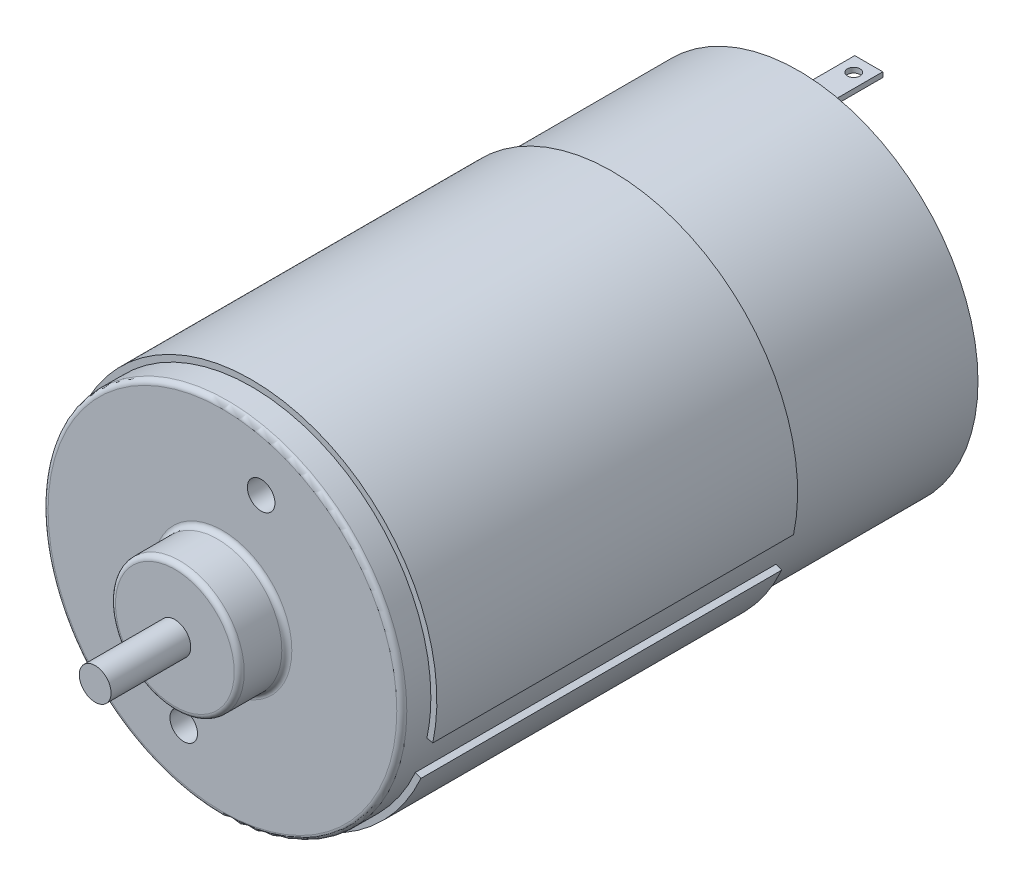
ISO-10303-21;
HEADER;
FILE_DESCRIPTION(('STEP AP214'),'2;1');
FILE_NAME('part.step','',(''),(''),'','','');
FILE_SCHEMA(('AUTOMOTIVE_DESIGN { 1 0 10303 214 1 1 1 1 }'));
ENDSEC;
DATA;
#1=APPLICATION_CONTEXT('core data for automotive mechanical design processes');
#2=APPLICATION_PROTOCOL_DEFINITION('international standard','automotive_design',2000,#1);
#3=PRODUCT_CONTEXT('',#1,'mechanical');
#4=PRODUCT('Part','Part','',(#3));
#5=PRODUCT_RELATED_PRODUCT_CATEGORY('part','',(#4));
#6=PRODUCT_DEFINITION_FORMATION('','',#4);
#7=PRODUCT_DEFINITION_CONTEXT('part definition',#1,'design');
#8=PRODUCT_DEFINITION('design','',#6,#7);
#9=PRODUCT_DEFINITION_SHAPE('','',#8);
#10=(LENGTH_UNIT() NAMED_UNIT(*) SI_UNIT(.MILLI.,.METRE.));
#11=(NAMED_UNIT(*) PLANE_ANGLE_UNIT() SI_UNIT($,.RADIAN.));
#12=(NAMED_UNIT(*) SI_UNIT($,.STERADIAN.) SOLID_ANGLE_UNIT());
#13=UNCERTAINTY_MEASURE_WITH_UNIT(LENGTH_MEASURE(1.E-05),#10,'distance_accuracy_value','');
#14=(GEOMETRIC_REPRESENTATION_CONTEXT(3) GLOBAL_UNCERTAINTY_ASSIGNED_CONTEXT((#13)) GLOBAL_UNIT_ASSIGNED_CONTEXT((#10,
#11,#12)) REPRESENTATION_CONTEXT('',''));
#15=CARTESIAN_POINT('',(0.,0.,0.));
#16=DIRECTION('',(0.,0.,1.));
#17=DIRECTION('',(1.,0.,0.));
#18=AXIS2_PLACEMENT_3D('',#15,#16,#17);
#19=CARTESIAN_POINT('',(0.,0.,57.5));
#20=DIRECTION('',(0.,0.,-1.));
#21=DIRECTION('',(-1.,0.,0.));
#22=AXIS2_PLACEMENT_3D('',#19,#20,#21);
#23=CYLINDRICAL_SURFACE('',#22,17.9);
#24=CARTESIAN_POINT('',(0.,0.,57.));
#25=DIRECTION('',(0.,0.,1.));
#26=DIRECTION('',(1.,0.,0.));
#27=AXIS2_PLACEMENT_3D('',#24,#25,#26);
#28=CIRCLE('',#27,17.9);
#29=CARTESIAN_POINT('',(17.9,0.,57.));
#30=VERTEX_POINT('',#29);
#31=EDGE_CURVE('E12',#30,#30,#28,.F.);
#32=ORIENTED_EDGE('',*,*,#31,.T.);
#33=EDGE_LOOP('',(#32));
#34=FACE_BOUND('',#33,.T.);
#35=CARTESIAN_POINT('',(0.,0.,0.));
#36=DIRECTION('',(0.,0.,1.));
#37=DIRECTION('',(1.,0.,0.));
#38=AXIS2_PLACEMENT_3D('',#35,#36,#37);
#39=CIRCLE('',#38,17.9);
#40=CARTESIAN_POINT('',(17.9,0.,0.));
#41=VERTEX_POINT('',#40);
#42=EDGE_CURVE('E337',#41,#41,#39,.T.);
#43=ORIENTED_EDGE('',*,*,#42,.T.);
#44=EDGE_LOOP('',(#43));
#45=FACE_BOUND('',#44,.T.);
#46=CARTESIAN_POINT('',(0.,0.,18.6));
#47=DIRECTION('',(0.,0.,1.));
#48=DIRECTION('',(1.,0.,0.));
#49=AXIS2_PLACEMENT_3D('',#46,#47,#48);
#50=CIRCLE('',#49,17.9);
#51=CARTESIAN_POINT('',(17.5070648099402,-3.72997074258686,18.6));
#52=VERTEX_POINT('',#51);
#53=CARTESIAN_POINT('',(16.3559347468402,-7.27278478693722,18.6));
#54=VERTEX_POINT('',#53);
#55=EDGE_CURVE('E161',#52,#54,#50,.T.);
#56=ORIENTED_EDGE('',*,*,#55,.F.);
#57=DIRECTION('',(0.,0.,1.));
#58=VECTOR('',#57,1.);
#59=CARTESIAN_POINT('',(17.5070648099402,-3.72997074258686,18.6));
#60=LINE('',#59,#58);
#61=CARTESIAN_POINT('',(17.5070648099402,-3.72997074258686,54.6));
#62=VERTEX_POINT('',#61);
#63=EDGE_CURVE('E167',#52,#62,#60,.T.);
#64=ORIENTED_EDGE('',*,*,#63,.T.);
#65=CARTESIAN_POINT('',(0.,0.,54.6));
#66=DIRECTION('',(0.,0.,1.));
#67=DIRECTION('',(1.,0.,0.));
#68=AXIS2_PLACEMENT_3D('',#65,#66,#67);
#69=CIRCLE('',#68,17.9);
#70=CARTESIAN_POINT('',(16.3559347468402,-7.27278478693722,54.6));
#71=VERTEX_POINT('',#70);
#72=EDGE_CURVE('E171',#62,#71,#69,.T.);
#73=ORIENTED_EDGE('',*,*,#72,.T.);
#74=DIRECTION('',(0.,0.,1.));
#75=VECTOR('',#74,1.);
#76=CARTESIAN_POINT('',(16.3559347468402,-7.27278478693722,18.6));
#77=LINE('',#76,#75);
#78=EDGE_CURVE('E197',#54,#71,#77,.T.);
#79=ORIENTED_EDGE('',*,*,#78,.F.);
#80=EDGE_LOOP('',(#56,#64,#73,#79));
#81=FACE_BOUND('',#80,.T.);
#82=ADVANCED_FACE('F59',(#34,#45,#81),#23,.T.);
#83=CARTESIAN_POINT('',(0.,0.,0.));
#84=DIRECTION('',(0.,0.,1.));
#85=DIRECTION('',(1.,0.,0.));
#86=AXIS2_PLACEMENT_3D('',#83,#84,#85);
#87=PLANE('',#86);
#88=DIRECTION('',(0.,-1.,0.));
#89=VECTOR('',#88,1.);
#90=CARTESIAN_POINT('',(1.4,15.,0.));
#91=LINE('',#90,#89);
#92=CARTESIAN_POINT('',(1.4,15.,0.));
#93=VERTEX_POINT('',#92);
#94=CARTESIAN_POINT('',(1.40000000000001,14.5,0.));
#95=VERTEX_POINT('',#94);
#96=EDGE_CURVE('E249',#93,#95,#91,.T.);
#97=ORIENTED_EDGE('',*,*,#96,.F.);
#98=DIRECTION('',(1.,0.,0.));
#99=VECTOR('',#98,1.);
#100=CARTESIAN_POINT('',(1.4,15.,0.));
#101=LINE('',#100,#99);
#102=CARTESIAN_POINT('',(-1.4,15.,0.));
#103=VERTEX_POINT('',#102);
#104=EDGE_CURVE('E266',#103,#93,#101,.T.);
#105=ORIENTED_EDGE('',*,*,#104,.F.);
#106=DIRECTION('',(0.,1.,0.));
#107=VECTOR('',#106,1.);
#108=CARTESIAN_POINT('',(-1.4,15.,0.));
#109=LINE('',#108,#107);
#110=CARTESIAN_POINT('',(-1.4,14.5,0.));
#111=VERTEX_POINT('',#110);
#112=EDGE_CURVE('E283',#111,#103,#109,.T.);
#113=ORIENTED_EDGE('',*,*,#112,.F.);
#114=DIRECTION('',(-1.,0.,0.));
#115=VECTOR('',#114,1.);
#116=CARTESIAN_POINT('',(1.40000000000001,14.5,0.));
#117=LINE('',#116,#115);
#118=EDGE_CURVE('E279',#95,#111,#117,.T.);
#119=ORIENTED_EDGE('',*,*,#118,.F.);
#120=EDGE_LOOP('',(#97,#105,#113,#119));
#121=FACE_BOUND('',#120,.T.);
#122=CARTESIAN_POINT('',(0.,0.,0.));
#123=DIRECTION('',(0.,0.,1.));
#124=DIRECTION('',(1.,0.,0.));
#125=AXIS2_PLACEMENT_3D('',#122,#123,#124);
#126=CIRCLE('',#125,5.3);
#127=CARTESIAN_POINT('',(5.3,0.,0.));
#128=VERTEX_POINT('',#127);
#129=EDGE_CURVE('E333',#128,#128,#126,.T.);
#130=ORIENTED_EDGE('',*,*,#129,.T.);
#131=EDGE_LOOP('',(#130));
#132=FACE_BOUND('',#131,.T.);
#133=ORIENTED_EDGE('',*,*,#42,.F.);
#134=EDGE_LOOP('',(#133));
#135=FACE_BOUND('',#134,.T.);
#136=DIRECTION('',(-1.,0.,0.));
#137=VECTOR('',#136,1.);
#138=CARTESIAN_POINT('',(1.4,-15.,0.));
#139=LINE('',#138,#137);
#140=CARTESIAN_POINT('',(1.4,-15.,0.));
#141=VERTEX_POINT('',#140);
#142=CARTESIAN_POINT('',(-1.4,-15.,0.));
#143=VERTEX_POINT('',#142);
#144=EDGE_CURVE('E245',#141,#143,#139,.T.);
#145=ORIENTED_EDGE('',*,*,#144,.F.);
#146=DIRECTION('',(0.,-1.,0.));
#147=VECTOR('',#146,1.);
#148=CARTESIAN_POINT('',(1.4,-15.,0.));
#149=LINE('',#148,#147);
#150=CARTESIAN_POINT('',(1.40000000000001,-14.5,0.));
#151=VERTEX_POINT('',#150);
#152=EDGE_CURVE('E234',#151,#141,#149,.T.);
#153=ORIENTED_EDGE('',*,*,#152,.F.);
#154=DIRECTION('',(1.,0.,0.));
#155=VECTOR('',#154,1.);
#156=CARTESIAN_POINT('',(1.40000000000001,-14.5,0.));
#157=LINE('',#156,#155);
#158=CARTESIAN_POINT('',(-1.40000000000001,-14.5,0.));
#159=VERTEX_POINT('',#158);
#160=EDGE_CURVE('E238',#159,#151,#157,.T.);
#161=ORIENTED_EDGE('',*,*,#160,.F.);
#162=DIRECTION('',(0.,1.,0.));
#163=VECTOR('',#162,1.);
#164=CARTESIAN_POINT('',(-1.4,-15.,0.));
#165=LINE('',#164,#163);
#166=EDGE_CURVE('E83',#143,#159,#165,.T.);
#167=ORIENTED_EDGE('',*,*,#166,.F.);
#168=EDGE_LOOP('',(#145,#153,#161,#167));
#169=FACE_BOUND('',#168,.T.);
#170=ADVANCED_FACE('F388',(#121,#132,#135,#169),#87,.F.);
#171=CARTESIAN_POINT('',(0.,0.,57.5));
#172=DIRECTION('',(0.,0.,1.));
#173=DIRECTION('',(1.,0.,0.));
#174=AXIS2_PLACEMENT_3D('',#171,#172,#173);
#175=PLANE('',#174);
#176=CARTESIAN_POINT('',(0.,0.,57.5));
#177=DIRECTION('',(0.,0.,1.));
#178=DIRECTION('',(1.,0.,0.));
#179=AXIS2_PLACEMENT_3D('',#176,#177,#178);
#180=CIRCLE('',#179,6.925);
#181=CARTESIAN_POINT('',(6.925,0.,57.5));
#182=VERTEX_POINT('',#181);
#183=EDGE_CURVE('E356',#182,#182,#180,.F.);
#184=ORIENTED_EDGE('',*,*,#183,.T.);
#185=EDGE_LOOP('',(#184));
#186=FACE_BOUND('',#185,.T.);
#187=CARTESIAN_POINT('',(0.,0.,57.5));
#188=DIRECTION('',(0.,0.,1.));
#189=DIRECTION('',(1.,0.,0.));
#190=AXIS2_PLACEMENT_3D('',#187,#188,#189);
#191=CIRCLE('',#190,17.4);
#192=CARTESIAN_POINT('',(17.4,0.,57.5));
#193=VERTEX_POINT('',#192);
#194=EDGE_CURVE('E352',#193,#193,#191,.T.);
#195=ORIENTED_EDGE('',*,*,#194,.T.);
#196=EDGE_LOOP('',(#195));
#197=FACE_BOUND('',#196,.T.);
#198=CARTESIAN_POINT('',(3.86271242968684,11.8882064536894,57.5));
#199=DIRECTION('',(0.,0.,1.));
#200=DIRECTION('',(1.,0.,0.));
#201=AXIS2_PLACEMENT_3D('',#198,#199,#200);
#202=CIRCLE('',#201,1.375);
#203=CARTESIAN_POINT('',(5.23771242968684,11.8882064536894,57.5));
#204=VERTEX_POINT('',#203);
#205=EDGE_CURVE('E311',#204,#204,#202,.T.);
#206=ORIENTED_EDGE('',*,*,#205,.F.);
#207=EDGE_LOOP('',(#206));
#208=FACE_BOUND('',#207,.T.);
#209=CARTESIAN_POINT('',(-3.86271242968685,-11.8882064536894,57.5));
#210=DIRECTION('',(0.,0.,1.));
#211=DIRECTION('',(1.,0.,0.));
#212=AXIS2_PLACEMENT_3D('',#209,#210,#211);
#213=CIRCLE('',#212,1.375);
#214=CARTESIAN_POINT('',(-2.48771242968685,-11.8882064536894,57.5));
#215=VERTEX_POINT('',#214);
#216=EDGE_CURVE('E305',#215,#215,#213,.T.);
#217=ORIENTED_EDGE('',*,*,#216,.F.);
#218=EDGE_LOOP('',(#217));
#219=FACE_BOUND('',#218,.T.);
#220=ADVANCED_FACE('F396',(#186,#197,#208,#219),#175,.T.);
#221=CARTESIAN_POINT('',(0.,0.,-2.8));
#222=DIRECTION('',(0.,0.,1.));
#223=DIRECTION('',(1.,0.,0.));
#224=AXIS2_PLACEMENT_3D('',#221,#222,#223);
#225=CYLINDRICAL_SURFACE('',#224,5.3);
#226=CARTESIAN_POINT('',(0.,0.,-2.3));
#227=DIRECTION('',(0.,0.,1.));
#228=DIRECTION('',(1.,0.,0.));
#229=AXIS2_PLACEMENT_3D('',#226,#227,#228);
#230=CIRCLE('',#229,5.3);
#231=CARTESIAN_POINT('',(5.3,0.,-2.3));
#232=VERTEX_POINT('',#231);
#233=EDGE_CURVE('E360',#232,#232,#230,.T.);
#234=ORIENTED_EDGE('',*,*,#233,.T.);
#235=EDGE_LOOP('',(#234));
#236=FACE_BOUND('',#235,.T.);
#237=ORIENTED_EDGE('',*,*,#129,.F.);
#238=EDGE_LOOP('',(#237));
#239=FACE_BOUND('',#238,.T.);
#240=ADVANCED_FACE('F503',(#236,#239),#225,.T.);
#241=CARTESIAN_POINT('',(0.,0.,-2.8));
#242=DIRECTION('',(0.,0.,1.));
#243=DIRECTION('',(1.,0.,0.));
#244=AXIS2_PLACEMENT_3D('',#241,#242,#243);
#245=PLANE('',#244);
#246=CARTESIAN_POINT('',(0.,0.,-2.8));
#247=DIRECTION('',(0.,0.,1.));
#248=DIRECTION('',(1.,0.,0.));
#249=AXIS2_PLACEMENT_3D('',#246,#247,#248);
#250=CIRCLE('',#249,4.8);
#251=CARTESIAN_POINT('',(4.8,0.,-2.8));
#252=VERTEX_POINT('',#251);
#253=EDGE_CURVE('E364',#252,#252,#250,.F.);
#254=ORIENTED_EDGE('',*,*,#253,.T.);
#255=EDGE_LOOP('',(#254));
#256=FACE_BOUND('',#255,.T.);
#257=CARTESIAN_POINT('',(0.,0.,-2.8));
#258=DIRECTION('',(0.,0.,1.));
#259=DIRECTION('',(1.,0.,0.));
#260=AXIS2_PLACEMENT_3D('',#257,#258,#259);
#261=CIRCLE('',#260,1.5875);
#262=CARTESIAN_POINT('',(1.5875,0.,-2.8));
#263=VERTEX_POINT('',#262);
#264=EDGE_CURVE('E329',#263,#263,#261,.F.);
#265=ORIENTED_EDGE('',*,*,#264,.F.);
#266=EDGE_LOOP('',(#265));
#267=FACE_BOUND('',#266,.T.);
#268=ADVANCED_FACE('F500',(#256,#267),#245,.F.);
#269=CARTESIAN_POINT('',(0.,0.,57.5));
#270=DIRECTION('',(0.,0.,-1.));
#271=DIRECTION('',(-1.,0.,0.));
#272=AXIS2_PLACEMENT_3D('',#269,#270,#271);
#273=CYLINDRICAL_SURFACE('',#272,1.5875);
#274=CARTESIAN_POINT('',(0.,0.,-4.8));
#275=DIRECTION('',(0.,0.,1.));
#276=DIRECTION('',(1.,0.,0.));
#277=AXIS2_PLACEMENT_3D('',#274,#275,#276);
#278=CIRCLE('',#277,1.5875);
#279=CARTESIAN_POINT('',(1.5875,0.,-4.8));
#280=VERTEX_POINT('',#279);
#281=EDGE_CURVE('E325',#280,#280,#278,.T.);
#282=ORIENTED_EDGE('',*,*,#281,.T.);
#283=EDGE_LOOP('',(#282));
#284=FACE_BOUND('',#283,.T.);
#285=ORIENTED_EDGE('',*,*,#264,.T.);
#286=EDGE_LOOP('',(#285));
#287=FACE_BOUND('',#286,.T.);
#288=ADVANCED_FACE('F496',(#284,#287),#273,.T.);
#289=CARTESIAN_POINT('',(0.,0.,-4.8));
#290=DIRECTION('',(0.,0.,1.));
#291=DIRECTION('',(1.,0.,0.));
#292=AXIS2_PLACEMENT_3D('',#289,#290,#291);
#293=PLANE('',#292);
#294=ORIENTED_EDGE('',*,*,#281,.F.);
#295=EDGE_LOOP('',(#294));
#296=FACE_BOUND('',#295,.T.);
#297=ADVANCED_FACE('F485',(#296),#293,.F.);
#298=CARTESIAN_POINT('',(-3.86271242968685,-11.8882064536894,54.5));
#299=DIRECTION('',(0.,0.,1.));
#300=DIRECTION('',(1.,0.,0.));
#301=AXIS2_PLACEMENT_3D('',#298,#299,#300);
#302=CYLINDRICAL_SURFACE('',#301,1.375);
#303=CARTESIAN_POINT('',(-3.86271242968685,-11.8882064536894,54.5));
#304=DIRECTION('',(0.,0.,1.));
#305=DIRECTION('',(1.,0.,0.));
#306=AXIS2_PLACEMENT_3D('',#303,#304,#305);
#307=CIRCLE('',#306,1.375);
#308=CARTESIAN_POINT('',(-2.48771242968685,-11.8882064536894,54.5));
#309=VERTEX_POINT('',#308);
#310=EDGE_CURVE('E315',#309,#309,#307,.T.);
#311=ORIENTED_EDGE('',*,*,#310,.F.);
#312=EDGE_LOOP('',(#311));
#313=FACE_BOUND('',#312,.T.);
#314=ORIENTED_EDGE('',*,*,#216,.T.);
#315=EDGE_LOOP('',(#314));
#316=FACE_BOUND('',#315,.T.);
#317=ADVANCED_FACE('F481',(#313,#316),#302,.F.);
#318=CARTESIAN_POINT('',(0.,0.,54.5));
#319=DIRECTION('',(0.,0.,1.));
#320=DIRECTION('',(1.,0.,0.));
#321=AXIS2_PLACEMENT_3D('',#318,#319,#320);
#322=PLANE('',#321);
#323=ORIENTED_EDGE('',*,*,#310,.T.);
#324=EDGE_LOOP('',(#323));
#325=FACE_BOUND('',#324,.T.);
#326=ADVANCED_FACE('F477',(#325),#322,.T.);
#327=CARTESIAN_POINT('',(3.86271242968684,11.8882064536894,54.5));
#328=DIRECTION('',(0.,0.,1.));
#329=DIRECTION('',(1.,0.,0.));
#330=AXIS2_PLACEMENT_3D('',#327,#328,#329);
#331=CYLINDRICAL_SURFACE('',#330,1.375);
#332=CARTESIAN_POINT('',(3.86271242968684,11.8882064536894,54.5));
#333=DIRECTION('',(0.,0.,1.));
#334=DIRECTION('',(1.,0.,0.));
#335=AXIS2_PLACEMENT_3D('',#332,#333,#334);
#336=CIRCLE('',#335,1.375);
#337=CARTESIAN_POINT('',(5.23771242968684,11.8882064536894,54.5));
#338=VERTEX_POINT('',#337);
#339=EDGE_CURVE('E306',#338,#338,#336,.T.);
#340=ORIENTED_EDGE('',*,*,#339,.F.);
#341=EDGE_LOOP('',(#340));
#342=FACE_BOUND('',#341,.T.);
#343=ORIENTED_EDGE('',*,*,#205,.T.);
#344=EDGE_LOOP('',(#343));
#345=FACE_BOUND('',#344,.T.);
#346=ADVANCED_FACE('F473',(#342,#345),#331,.F.);
#347=CARTESIAN_POINT('',(0.,0.,54.5));
#348=DIRECTION('',(0.,0.,1.));
#349=DIRECTION('',(1.,0.,0.));
#350=AXIS2_PLACEMENT_3D('',#347,#348,#349);
#351=PLANE('',#350);
#352=ORIENTED_EDGE('',*,*,#339,.T.);
#353=EDGE_LOOP('',(#352));
#354=FACE_BOUND('',#353,.T.);
#355=ADVANCED_FACE('F469',(#354),#351,.T.);
#356=CARTESIAN_POINT('',(1.4,15.,-7.));
#357=DIRECTION('',(-1.,0.,0.));
#358=DIRECTION('',(0.,-1.,0.));
#359=AXIS2_PLACEMENT_3D('',#356,#357,#358);
#360=PLANE('',#359);
#361=ORIENTED_EDGE('',*,*,#96,.T.);
#362=DIRECTION('',(0.,0.,1.));
#363=VECTOR('',#362,1.);
#364=CARTESIAN_POINT('',(1.40000000000001,14.5,-7.));
#365=LINE('',#364,#363);
#366=CARTESIAN_POINT('',(1.40000000000001,14.5,-7.));
#367=VERTEX_POINT('',#366);
#368=EDGE_CURVE('E301',#367,#95,#365,.T.);
#369=ORIENTED_EDGE('',*,*,#368,.F.);
#370=DIRECTION('',(0.,-1.,0.));
#371=VECTOR('',#370,1.);
#372=CARTESIAN_POINT('',(1.4,15.,-7.));
#373=LINE('',#372,#371);
#374=CARTESIAN_POINT('',(1.4,15.,-7.));
#375=VERTEX_POINT('',#374);
#376=EDGE_CURVE('E261',#375,#367,#373,.T.);
#377=ORIENTED_EDGE('',*,*,#376,.F.);
#378=DIRECTION('',(0.,0.,1.));
#379=VECTOR('',#378,1.);
#380=CARTESIAN_POINT('',(1.4,15.,-7.));
#381=LINE('',#380,#379);
#382=EDGE_CURVE('E275',#375,#93,#381,.T.);
#383=ORIENTED_EDGE('',*,*,#382,.T.);
#384=EDGE_LOOP('',(#361,#369,#377,#383));
#385=FACE_BOUND('',#384,.T.);
#386=ADVANCED_FACE('F465',(#385),#360,.F.);
#387=CARTESIAN_POINT('',(1.40000000000001,14.5,-7.));
#388=DIRECTION('',(0.,1.,0.));
#389=DIRECTION('',(0.,0.,1.));
#390=AXIS2_PLACEMENT_3D('',#387,#388,#389);
#391=PLANE('',#390);
#392=CARTESIAN_POINT('',(0.,14.5,-5.5));
#393=DIRECTION('',(0.,1.,0.));
#394=DIRECTION('',(0.,0.,1.));
#395=AXIS2_PLACEMENT_3D('',#392,#393,#394);
#396=CIRCLE('',#395,0.625);
#397=CARTESIAN_POINT('',(0.,14.5,-4.875));
#398=VERTEX_POINT('',#397);
#399=EDGE_CURVE('E214',#398,#398,#396,.T.);
#400=ORIENTED_EDGE('',*,*,#399,.T.);
#401=EDGE_LOOP('',(#400));
#402=FACE_BOUND('',#401,.T.);
#403=ORIENTED_EDGE('',*,*,#118,.T.);
#404=DIRECTION('',(0.,0.,1.));
#405=VECTOR('',#404,1.);
#406=CARTESIAN_POINT('',(-1.4,14.5,-7.));
#407=LINE('',#406,#405);
#408=CARTESIAN_POINT('',(-1.4,14.5,-7.));
#409=VERTEX_POINT('',#408);
#410=EDGE_CURVE('E297',#409,#111,#407,.T.);
#411=ORIENTED_EDGE('',*,*,#410,.F.);
#412=DIRECTION('',(-1.,0.,0.));
#413=VECTOR('',#412,1.);
#414=CARTESIAN_POINT('',(1.40000000000001,14.5,-7.));
#415=LINE('',#414,#413);
#416=EDGE_CURVE('E265',#367,#409,#415,.T.);
#417=ORIENTED_EDGE('',*,*,#416,.F.);
#418=ORIENTED_EDGE('',*,*,#368,.T.);
#419=EDGE_LOOP('',(#403,#411,#417,#418));
#420=FACE_BOUND('',#419,.T.);
#421=ADVANCED_FACE('F461',(#402,#420),#391,.F.);
#422=CARTESIAN_POINT('',(-1.4,15.,-7.));
#423=DIRECTION('',(1.,0.,0.));
#424=DIRECTION('',(0.,1.,0.));
#425=AXIS2_PLACEMENT_3D('',#422,#423,#424);
#426=PLANE('',#425);
#427=ORIENTED_EDGE('',*,*,#112,.T.);
#428=DIRECTION('',(0.,0.,1.));
#429=VECTOR('',#428,1.);
#430=CARTESIAN_POINT('',(-1.4,15.,-7.));
#431=LINE('',#430,#429);
#432=CARTESIAN_POINT('',(-1.4,15.,-7.));
#433=VERTEX_POINT('',#432);
#434=EDGE_CURVE('E293',#433,#103,#431,.T.);
#435=ORIENTED_EDGE('',*,*,#434,.F.);
#436=DIRECTION('',(0.,1.,0.));
#437=VECTOR('',#436,1.);
#438=CARTESIAN_POINT('',(-1.4,15.,-7.));
#439=LINE('',#438,#437);
#440=EDGE_CURVE('E269',#409,#433,#439,.T.);
#441=ORIENTED_EDGE('',*,*,#440,.F.);
#442=ORIENTED_EDGE('',*,*,#410,.T.);
#443=EDGE_LOOP('',(#427,#435,#441,#442));
#444=FACE_BOUND('',#443,.T.);
#445=ADVANCED_FACE('F457',(#444),#426,.F.);
#446=CARTESIAN_POINT('',(1.4,15.,-7.));
#447=DIRECTION('',(0.,-1.,0.));
#448=DIRECTION('',(0.,0.,-1.));
#449=AXIS2_PLACEMENT_3D('',#446,#447,#448);
#450=PLANE('',#449);
#451=CARTESIAN_POINT('',(0.,15.,-5.5));
#452=DIRECTION('',(0.,1.,0.));
#453=DIRECTION('',(0.,0.,1.));
#454=AXIS2_PLACEMENT_3D('',#451,#452,#453);
#455=CIRCLE('',#454,0.625);
#456=CARTESIAN_POINT('',(0.,15.,-4.875));
#457=VERTEX_POINT('',#456);
#458=EDGE_CURVE('E205',#457,#457,#455,.T.);
#459=ORIENTED_EDGE('',*,*,#458,.F.);
#460=EDGE_LOOP('',(#459));
#461=FACE_BOUND('',#460,.T.);
#462=ORIENTED_EDGE('',*,*,#104,.T.);
#463=ORIENTED_EDGE('',*,*,#382,.F.);
#464=DIRECTION('',(1.,0.,0.));
#465=VECTOR('',#464,1.);
#466=CARTESIAN_POINT('',(1.4,15.,-7.));
#467=LINE('',#466,#465);
#468=EDGE_CURVE('E272',#433,#375,#467,.T.);
#469=ORIENTED_EDGE('',*,*,#468,.F.);
#470=ORIENTED_EDGE('',*,*,#434,.T.);
#471=EDGE_LOOP('',(#462,#463,#469,#470));
#472=FACE_BOUND('',#471,.T.);
#473=ADVANCED_FACE('F453',(#461,#472),#450,.F.);
#474=CARTESIAN_POINT('',(0.,0.,-7.));
#475=DIRECTION('',(0.,0.,-1.));
#476=DIRECTION('',(-1.,0.,0.));
#477=AXIS2_PLACEMENT_3D('',#474,#475,#476);
#478=PLANE('',#477);
#479=ORIENTED_EDGE('',*,*,#376,.T.);
#480=ORIENTED_EDGE('',*,*,#416,.T.);
#481=ORIENTED_EDGE('',*,*,#440,.T.);
#482=ORIENTED_EDGE('',*,*,#468,.T.);
#483=EDGE_LOOP('',(#479,#480,#481,#482));
#484=FACE_BOUND('',#483,.T.);
#485=ADVANCED_FACE('F434',(#484),#478,.T.);
#486=CARTESIAN_POINT('',(1.4,-15.,-7.));
#487=DIRECTION('',(0.,1.,0.));
#488=DIRECTION('',(0.,0.,1.));
#489=AXIS2_PLACEMENT_3D('',#486,#487,#488);
#490=PLANE('',#489);
#491=CARTESIAN_POINT('',(0.,-15.,-5.5));
#492=DIRECTION('',(0.,1.,0.));
#493=DIRECTION('',(0.,0.,1.));
#494=AXIS2_PLACEMENT_3D('',#491,#492,#493);
#495=CIRCLE('',#494,0.625);
#496=CARTESIAN_POINT('',(0.,-15.,-4.875));
#497=VERTEX_POINT('',#496);
#498=EDGE_CURVE('E210',#497,#497,#495,.T.);
#499=ORIENTED_EDGE('',*,*,#498,.T.);
#500=EDGE_LOOP('',(#499));
#501=FACE_BOUND('',#500,.T.);
#502=ORIENTED_EDGE('',*,*,#144,.T.);
#503=DIRECTION('',(0.,0.,1.));
#504=VECTOR('',#503,1.);
#505=CARTESIAN_POINT('',(-1.4,-15.,-7.));
#506=LINE('',#505,#504);
#507=CARTESIAN_POINT('',(-1.4,-15.,-7.));
#508=VERTEX_POINT('',#507);
#509=EDGE_CURVE('E218',#508,#143,#506,.T.);
#510=ORIENTED_EDGE('',*,*,#509,.F.);
#511=DIRECTION('',(-1.,0.,0.));
#512=VECTOR('',#511,1.);
#513=CARTESIAN_POINT('',(1.4,-15.,-7.));
#514=LINE('',#513,#512);
#515=CARTESIAN_POINT('',(1.4,-15.,-7.));
#516=VERTEX_POINT('',#515);
#517=EDGE_CURVE('E239',#516,#508,#514,.T.);
#518=ORIENTED_EDGE('',*,*,#517,.F.);
#519=DIRECTION('',(0.,0.,1.));
#520=VECTOR('',#519,1.);
#521=CARTESIAN_POINT('',(1.4,-15.,-7.));
#522=LINE('',#521,#520);
#523=EDGE_CURVE('E229',#516,#141,#522,.T.);
#524=ORIENTED_EDGE('',*,*,#523,.T.);
#525=EDGE_LOOP('',(#502,#510,#518,#524));
#526=FACE_BOUND('',#525,.T.);
#527=ADVANCED_FACE('F430',(#501,#526),#490,.F.);
#528=CARTESIAN_POINT('',(-1.4,-15.,-7.));
#529=DIRECTION('',(1.,0.,0.));
#530=DIRECTION('',(0.,1.,0.));
#531=AXIS2_PLACEMENT_3D('',#528,#529,#530);
#532=PLANE('',#531);
#533=ORIENTED_EDGE('',*,*,#166,.T.);
#534=DIRECTION('',(0.,0.,1.));
#535=VECTOR('',#534,1.);
#536=CARTESIAN_POINT('',(-1.40000000000001,-14.5,-7.));
#537=LINE('',#536,#535);
#538=CARTESIAN_POINT('',(-1.40000000000001,-14.5,-7.));
#539=VERTEX_POINT('',#538);
#540=EDGE_CURVE('E221',#539,#159,#537,.T.);
#541=ORIENTED_EDGE('',*,*,#540,.F.);
#542=DIRECTION('',(0.,1.,0.));
#543=VECTOR('',#542,1.);
#544=CARTESIAN_POINT('',(-1.4,-15.,-7.));
#545=LINE('',#544,#543);
#546=EDGE_CURVE('E255',#508,#539,#545,.T.);
#547=ORIENTED_EDGE('',*,*,#546,.F.);
#548=ORIENTED_EDGE('',*,*,#509,.T.);
#549=EDGE_LOOP('',(#533,#541,#547,#548));
#550=FACE_BOUND('',#549,.T.);
#551=ADVANCED_FACE('F433',(#550),#532,.F.);
#552=CARTESIAN_POINT('',(1.40000000000001,-14.5,-7.));
#553=DIRECTION('',(0.,-1.,0.));
#554=DIRECTION('',(0.,0.,-1.));
#555=AXIS2_PLACEMENT_3D('',#552,#553,#554);
#556=PLANE('',#555);
#557=CARTESIAN_POINT('',(0.,-14.5,-5.5));
#558=DIRECTION('',(0.,-1.,0.));
#559=DIRECTION('',(0.,0.,-1.));
#560=AXIS2_PLACEMENT_3D('',#557,#558,#559);
#561=CIRCLE('',#560,0.625);
#562=CARTESIAN_POINT('',(0.,-14.5,-6.125));
#563=VERTEX_POINT('',#562);
#564=EDGE_CURVE('E209',#563,#563,#561,.T.);
#565=ORIENTED_EDGE('',*,*,#564,.T.);
#566=EDGE_LOOP('',(#565));
#567=FACE_BOUND('',#566,.T.);
#568=ORIENTED_EDGE('',*,*,#160,.T.);
#569=DIRECTION('',(0.,0.,1.));
#570=VECTOR('',#569,1.);
#571=CARTESIAN_POINT('',(1.40000000000001,-14.5,-7.));
#572=LINE('',#571,#570);
#573=CARTESIAN_POINT('',(1.40000000000001,-14.5,-7.));
#574=VERTEX_POINT('',#573);
#575=EDGE_CURVE('E225',#574,#151,#572,.T.);
#576=ORIENTED_EDGE('',*,*,#575,.F.);
#577=DIRECTION('',(1.,0.,0.));
#578=VECTOR('',#577,1.);
#579=CARTESIAN_POINT('',(1.40000000000001,-14.5,-7.));
#580=LINE('',#579,#578);
#581=EDGE_CURVE('E252',#539,#574,#580,.T.);
#582=ORIENTED_EDGE('',*,*,#581,.F.);
#583=ORIENTED_EDGE('',*,*,#540,.T.);
#584=EDGE_LOOP('',(#568,#576,#582,#583));
#585=FACE_BOUND('',#584,.T.);
#586=ADVANCED_FACE('F438',(#567,#585),#556,.F.);
#587=CARTESIAN_POINT('',(1.4,-15.,-7.));
#588=DIRECTION('',(-1.,0.,0.));
#589=DIRECTION('',(0.,-1.,0.));
#590=AXIS2_PLACEMENT_3D('',#587,#588,#589);
#591=PLANE('',#590);
#592=ORIENTED_EDGE('',*,*,#152,.T.);
#593=ORIENTED_EDGE('',*,*,#523,.F.);
#594=DIRECTION('',(0.,-1.,0.));
#595=VECTOR('',#594,1.);
#596=CARTESIAN_POINT('',(1.4,-15.,-7.));
#597=LINE('',#596,#595);
#598=EDGE_CURVE('E233',#574,#516,#597,.T.);
#599=ORIENTED_EDGE('',*,*,#598,.F.);
#600=ORIENTED_EDGE('',*,*,#575,.T.);
#601=EDGE_LOOP('',(#592,#593,#599,#600));
#602=FACE_BOUND('',#601,.T.);
#603=ADVANCED_FACE('F442',(#602),#591,.F.);
#604=CARTESIAN_POINT('',(0.,0.,-7.));
#605=DIRECTION('',(0.,0.,-1.));
#606=DIRECTION('',(-1.,0.,0.));
#607=AXIS2_PLACEMENT_3D('',#604,#605,#606);
#608=PLANE('',#607);
#609=ORIENTED_EDGE('',*,*,#517,.T.);
#610=ORIENTED_EDGE('',*,*,#546,.T.);
#611=ORIENTED_EDGE('',*,*,#581,.T.);
#612=ORIENTED_EDGE('',*,*,#598,.T.);
#613=EDGE_LOOP('',(#609,#610,#611,#612));
#614=FACE_BOUND('',#613,.T.);
#615=ADVANCED_FACE('F446',(#614),#608,.T.);
#616=CARTESIAN_POINT('',(0.,-17.9,-5.5));
#617=DIRECTION('',(0.,1.,0.));
#618=DIRECTION('',(0.,0.,1.));
#619=AXIS2_PLACEMENT_3D('',#616,#617,#618);
#620=CYLINDRICAL_SURFACE('',#619,0.625);
#621=ORIENTED_EDGE('',*,*,#564,.F.);
#622=EDGE_LOOP('',(#621));
#623=FACE_BOUND('',#622,.T.);
#624=ORIENTED_EDGE('',*,*,#498,.F.);
#625=EDGE_LOOP('',(#624));
#626=FACE_BOUND('',#625,.T.);
#627=ADVANCED_FACE('F425',(#623,#626),#620,.F.);
#628=ORIENTED_EDGE('',*,*,#458,.T.);
#629=EDGE_LOOP('',(#628));
#630=FACE_BOUND('',#629,.T.);
#631=ORIENTED_EDGE('',*,*,#399,.F.);
#632=EDGE_LOOP('',(#631));
#633=FACE_BOUND('',#632,.T.);
#634=ADVANCED_FACE('F417',(#630,#633),#620,.F.);
#635=CARTESIAN_POINT('',(0.,0.,62.25));
#636=DIRECTION('',(0.,0.,-1.));
#637=DIRECTION('',(-1.,0.,0.));
#638=AXIS2_PLACEMENT_3D('',#635,#636,#637);
#639=CYLINDRICAL_SURFACE('',#638,6.425);
#640=CARTESIAN_POINT('',(0.,0.,58.));
#641=DIRECTION('',(0.,0.,1.));
#642=DIRECTION('',(1.,0.,0.));
#643=AXIS2_PLACEMENT_3D('',#640,#641,#642);
#644=CIRCLE('',#643,6.425);
#645=CARTESIAN_POINT('',(6.425,0.,58.));
#646=VERTEX_POINT('',#645);
#647=EDGE_CURVE('E348',#646,#646,#644,.T.);
#648=ORIENTED_EDGE('',*,*,#647,.T.);
#649=EDGE_LOOP('',(#648));
#650=FACE_BOUND('',#649,.T.);
#651=CARTESIAN_POINT('',(0.,0.,61.75));
#652=DIRECTION('',(0.,0.,1.));
#653=DIRECTION('',(1.,0.,0.));
#654=AXIS2_PLACEMENT_3D('',#651,#652,#653);
#655=CIRCLE('',#654,6.425);
#656=CARTESIAN_POINT('',(6.425,0.,61.75));
#657=VERTEX_POINT('',#656);
#658=EDGE_CURVE('E341',#657,#657,#655,.F.);
#659=ORIENTED_EDGE('',*,*,#658,.T.);
#660=EDGE_LOOP('',(#659));
#661=FACE_BOUND('',#660,.T.);
#662=ADVANCED_FACE('F414',(#650,#661),#639,.T.);
#663=CARTESIAN_POINT('',(0.,0.,62.25));
#664=DIRECTION('',(0.,0.,1.));
#665=DIRECTION('',(1.,0.,0.));
#666=AXIS2_PLACEMENT_3D('',#663,#664,#665);
#667=PLANE('',#666);
#668=CARTESIAN_POINT('',(0.,0.,62.25));
#669=DIRECTION('',(0.,0.,1.));
#670=DIRECTION('',(1.,0.,0.));
#671=AXIS2_PLACEMENT_3D('',#668,#669,#670);
#672=CIRCLE('',#671,5.925);
#673=CARTESIAN_POINT('',(5.925,0.,62.25));
#674=VERTEX_POINT('',#673);
#675=EDGE_CURVE('E68',#674,#674,#672,.T.);
#676=ORIENTED_EDGE('',*,*,#675,.T.);
#677=EDGE_LOOP('',(#676));
#678=FACE_BOUND('',#677,.T.);
#679=CARTESIAN_POINT('',(0.,0.,62.25));
#680=DIRECTION('',(0.,0.,1.));
#681=DIRECTION('',(1.,0.,0.));
#682=AXIS2_PLACEMENT_3D('',#679,#680,#681);
#683=CIRCLE('',#682,1.5875);
#684=CARTESIAN_POINT('',(1.5875,0.,62.25));
#685=VERTEX_POINT('',#684);
#686=EDGE_CURVE('E196',#685,#685,#683,.F.);
#687=ORIENTED_EDGE('',*,*,#686,.T.);
#688=EDGE_LOOP('',(#687));
#689=FACE_BOUND('',#688,.T.);
#690=ADVANCED_FACE('F371',(#678,#689),#667,.T.);
#691=CARTESIAN_POINT('',(0.,0.,70.2));
#692=DIRECTION('',(0.,0.,1.));
#693=DIRECTION('',(1.,0.,0.));
#694=AXIS2_PLACEMENT_3D('',#691,#692,#693);
#695=PLANE('',#694);
#696=CARTESIAN_POINT('',(0.,0.,70.2));
#697=DIRECTION('',(0.,0.,1.));
#698=DIRECTION('',(1.,0.,0.));
#699=AXIS2_PLACEMENT_3D('',#696,#697,#698);
#700=CIRCLE('',#699,1.5875);
#701=CARTESIAN_POINT('',(1.5875,0.,70.2));
#702=VERTEX_POINT('',#701);
#703=EDGE_CURVE('E310',#702,#702,#700,.T.);
#704=ORIENTED_EDGE('',*,*,#703,.T.);
#705=EDGE_LOOP('',(#704));
#706=FACE_BOUND('',#705,.T.);
#707=ADVANCED_FACE('F422',(#706),#695,.T.);
#708=CARTESIAN_POINT('',(0.,0.,70.2));
#709=DIRECTION('',(0.,0.,-1.));
#710=DIRECTION('',(-1.,0.,0.));
#711=AXIS2_PLACEMENT_3D('',#708,#709,#710);
#712=CYLINDRICAL_SURFACE('',#711,1.5875);
#713=ORIENTED_EDGE('',*,*,#686,.F.);
#714=EDGE_LOOP('',(#713));
#715=FACE_BOUND('',#714,.T.);
#716=ORIENTED_EDGE('',*,*,#703,.F.);
#717=EDGE_LOOP('',(#716));
#718=FACE_BOUND('',#717,.T.);
#719=ADVANCED_FACE('F489',(#715,#718),#712,.T.);
#720=CARTESIAN_POINT('',(0.,0.,18.6));
#721=DIRECTION('',(0.208378253775807,0.978048313404479,0.));
#722=DIRECTION('',(-0.978048313404479,0.208378253775807,0.));
#723=AXIS2_PLACEMENT_3D('',#720,#721,#722);
#724=PLANE('',#723);
#725=DIRECTION('',(-0.978048313404479,0.208378253775807,0.));
#726=VECTOR('',#725,1.);
#727=CARTESIAN_POINT('',(0.,0.,54.6));
#728=LINE('',#727,#726);
#729=CARTESIAN_POINT('',(18.0938937979829,-3.85499769485235,54.6));
#730=VERTEX_POINT('',#729);
#731=EDGE_CURVE('E184',#730,#62,#728,.T.);
#732=ORIENTED_EDGE('',*,*,#731,.T.);
#733=ORIENTED_EDGE('',*,*,#63,.F.);
#734=DIRECTION('',(-0.978048313404479,0.208378253775807,0.));
#735=VECTOR('',#734,1.);
#736=CARTESIAN_POINT('',(0.,0.,18.6));
#737=LINE('',#736,#735);
#738=CARTESIAN_POINT('',(18.0938937979829,-3.85499769485235,18.6));
#739=VERTEX_POINT('',#738);
#740=EDGE_CURVE('E164',#739,#52,#737,.T.);
#741=ORIENTED_EDGE('',*,*,#740,.F.);
#742=DIRECTION('',(0.,0.,1.));
#743=VECTOR('',#742,1.);
#744=CARTESIAN_POINT('',(18.0938937979829,-3.85499769485235,18.6));
#745=LINE('',#744,#743);
#746=EDGE_CURVE('E150',#739,#730,#745,.T.);
#747=ORIENTED_EDGE('',*,*,#746,.T.);
#748=EDGE_LOOP('',(#732,#733,#741,#747));
#749=FACE_BOUND('',#748,.T.);
#750=ADVANCED_FACE('F165',(#749),#724,.F.);
#751=CARTESIAN_POINT('',(-7.08343679226387E-13,-1.59301056406559E-12,18.6));
#752=DIRECTION('',(0.406300826085789,0.913739371331894,0.));
#753=DIRECTION('',(-0.913739371331894,0.406300826085789,0.));
#754=AXIS2_PLACEMENT_3D('',#751,#752,#753);
#755=PLANE('',#754);
#756=DIRECTION('',(-0.913739371331894,0.406300826085789,0.));
#757=VECTOR('',#756,1.);
#758=CARTESIAN_POINT('',(-7.08343679226387E-13,-1.59301056406559E-12,54.6));
#759=LINE('',#758,#757);
#760=CARTESIAN_POINT('',(16.9041783696393,-7.51656528258869,54.6));
#761=VERTEX_POINT('',#760);
#762=EDGE_CURVE('E75',#761,#71,#759,.T.);
#763=ORIENTED_EDGE('',*,*,#762,.F.);
#764=DIRECTION('',(0.,0.,1.));
#765=VECTOR('',#764,1.);
#766=CARTESIAN_POINT('',(16.9041783696393,-7.51656528258869,18.6));
#767=LINE('',#766,#765);
#768=CARTESIAN_POINT('',(16.9041783696393,-7.51656528258869,18.6));
#769=VERTEX_POINT('',#768);
#770=EDGE_CURVE('E160',#769,#761,#767,.T.);
#771=ORIENTED_EDGE('',*,*,#770,.F.);
#772=DIRECTION('',(-0.913739371331894,0.406300826085789,0.));
#773=VECTOR('',#772,1.);
#774=CARTESIAN_POINT('',(-7.08343679226387E-13,-1.59301056406559E-12,18.6));
#775=LINE('',#774,#773);
#776=EDGE_CURVE('E176',#769,#54,#775,.T.);
#777=ORIENTED_EDGE('',*,*,#776,.T.);
#778=ORIENTED_EDGE('',*,*,#78,.T.);
#779=EDGE_LOOP('',(#763,#771,#777,#778));
#780=FACE_BOUND('',#779,.T.);
#781=ADVANCED_FACE('F689',(#780),#755,.T.);
#782=CARTESIAN_POINT('',(0.,0.,18.6));
#783=DIRECTION('',(0.,0.,1.));
#784=DIRECTION('',(1.,0.,0.));
#785=AXIS2_PLACEMENT_3D('',#782,#783,#784);
#786=CYLINDRICAL_SURFACE('',#785,18.5);
#787=CARTESIAN_POINT('',(0.,0.,54.6));
#788=DIRECTION('',(0.,0.,1.));
#789=DIRECTION('',(1.,0.,0.));
#790=AXIS2_PLACEMENT_3D('',#787,#788,#789);
#791=CIRCLE('',#790,18.5);
#792=EDGE_CURVE('E155',#730,#761,#791,.T.);
#793=ORIENTED_EDGE('',*,*,#792,.F.);
#794=ORIENTED_EDGE('',*,*,#746,.F.);
#795=CARTESIAN_POINT('',(0.,0.,18.6));
#796=DIRECTION('',(0.,0.,1.));
#797=DIRECTION('',(1.,0.,0.));
#798=AXIS2_PLACEMENT_3D('',#795,#796,#797);
#799=CIRCLE('',#798,18.5);
#800=EDGE_CURVE('E154',#739,#769,#799,.T.);
#801=ORIENTED_EDGE('',*,*,#800,.T.);
#802=ORIENTED_EDGE('',*,*,#770,.T.);
#803=EDGE_LOOP('',(#793,#794,#801,#802));
#804=FACE_BOUND('',#803,.T.);
#805=ADVANCED_FACE('F152',(#804),#786,.T.);
#806=CARTESIAN_POINT('',(0.,0.,18.6));
#807=DIRECTION('',(0.,0.,1.));
#808=DIRECTION('',(1.,0.,0.));
#809=AXIS2_PLACEMENT_3D('',#806,#807,#808);
#810=PLANE('',#809);
#811=ORIENTED_EDGE('',*,*,#740,.T.);
#812=ORIENTED_EDGE('',*,*,#55,.T.);
#813=ORIENTED_EDGE('',*,*,#776,.F.);
#814=ORIENTED_EDGE('',*,*,#800,.F.);
#815=EDGE_LOOP('',(#811,#812,#813,#814));
#816=FACE_BOUND('',#815,.T.);
#817=ADVANCED_FACE('F174',(#816),#810,.F.);
#818=CARTESIAN_POINT('',(0.,0.,54.6));
#819=DIRECTION('',(0.,0.,1.));
#820=DIRECTION('',(1.,0.,0.));
#821=AXIS2_PLACEMENT_3D('',#818,#819,#820);
#822=PLANE('',#821);
#823=ORIENTED_EDGE('',*,*,#731,.F.);
#824=ORIENTED_EDGE('',*,*,#792,.T.);
#825=ORIENTED_EDGE('',*,*,#762,.T.);
#826=ORIENTED_EDGE('',*,*,#72,.F.);
#827=EDGE_LOOP('',(#823,#824,#825,#826));
#828=FACE_BOUND('',#827,.T.);
#829=ADVANCED_FACE('F403',(#828),#822,.T.);
#830=CARTESIAN_POINT('',(0.,0.,58.));
#831=DIRECTION('',(0.,0.,1.));
#832=DIRECTION('',(1.,0.,0.));
#833=AXIS2_PLACEMENT_3D('',#830,#831,#832);
#834=TOROIDAL_SURFACE('',#833,6.925,0.5);
#835=ORIENTED_EDGE('',*,*,#183,.F.);
#836=EDGE_LOOP('',(#835));
#837=FACE_BOUND('',#836,.T.);
#838=ORIENTED_EDGE('',*,*,#647,.F.);
#839=EDGE_LOOP('',(#838));
#840=FACE_BOUND('',#839,.T.);
#841=ADVANCED_FACE('F383',(#837,#840),#834,.F.);
#842=CARTESIAN_POINT('',(0.,0.,-2.3));
#843=DIRECTION('',(0.,0.,1.));
#844=DIRECTION('',(1.,0.,0.));
#845=AXIS2_PLACEMENT_3D('',#842,#843,#844);
#846=TOROIDAL_SURFACE('',#845,4.8,0.5);
#847=ORIENTED_EDGE('',*,*,#253,.F.);
#848=EDGE_LOOP('',(#847));
#849=FACE_BOUND('',#848,.T.);
#850=ORIENTED_EDGE('',*,*,#233,.F.);
#851=EDGE_LOOP('',(#850));
#852=FACE_BOUND('',#851,.T.);
#853=ADVANCED_FACE('F376',(#849,#852),#846,.T.);
#854=CARTESIAN_POINT('',(0.,0.,61.75));
#855=DIRECTION('',(0.,0.,1.));
#856=DIRECTION('',(1.,0.,0.));
#857=AXIS2_PLACEMENT_3D('',#854,#855,#856);
#858=TOROIDAL_SURFACE('',#857,5.925,0.5);
#859=ORIENTED_EDGE('',*,*,#658,.F.);
#860=EDGE_LOOP('',(#859));
#861=FACE_BOUND('',#860,.T.);
#862=ORIENTED_EDGE('',*,*,#675,.F.);
#863=EDGE_LOOP('',(#862));
#864=FACE_BOUND('',#863,.T.);
#865=ADVANCED_FACE('F374',(#861,#864),#858,.T.);
#866=CARTESIAN_POINT('',(0.,0.,57.));
#867=DIRECTION('',(0.,0.,1.));
#868=DIRECTION('',(1.,0.,0.));
#869=AXIS2_PLACEMENT_3D('',#866,#867,#868);
#870=TOROIDAL_SURFACE('',#869,17.4,0.5);
#871=ORIENTED_EDGE('',*,*,#31,.F.);
#872=EDGE_LOOP('',(#871));
#873=FACE_BOUND('',#872,.T.);
#874=ORIENTED_EDGE('',*,*,#194,.F.);
#875=EDGE_LOOP('',(#874));
#876=FACE_BOUND('',#875,.T.);
#877=ADVANCED_FACE('F61',(#873,#876),#870,.T.);
#878=CLOSED_SHELL('',(#82,#170,#220,#240,#268,#288,#297,#317,#326,#346,#355,#386,#421,#445,#473,
#485,#527,#551,#586,#603,#615,#627,#634,#662,#690,#707,#719,#750,#781,#805,#817,#829,#841,#853,
#865,#877));
#879=MANIFOLD_SOLID_BREP('B2',#878);
#880=ADVANCED_BREP_SHAPE_REPRESENTATION('',(#18,#879),#14);
#881=SHAPE_DEFINITION_REPRESENTATION(#9,#880);
ENDSEC;
END-ISO-10303-21;
